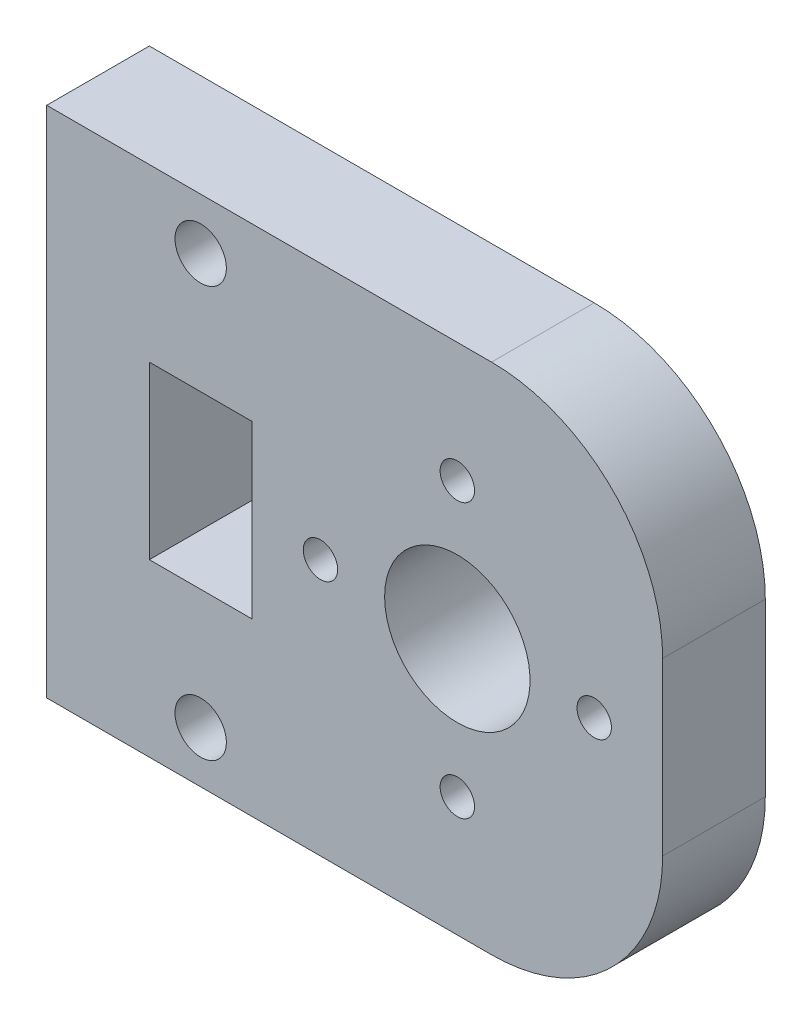
ISO-10303-21;
HEADER;
FILE_DESCRIPTION(('STEP AP214'),'2;1');
FILE_NAME('part.step','',(''),(''),'','','');
FILE_SCHEMA(('AUTOMOTIVE_DESIGN { 1 0 10303 214 1 1 1 1 }'));
ENDSEC;
DATA;
#1=APPLICATION_CONTEXT('core data for automotive mechanical design processes');
#2=APPLICATION_PROTOCOL_DEFINITION('international standard','automotive_design',2000,#1);
#3=PRODUCT_CONTEXT('',#1,'mechanical');
#4=PRODUCT('Part','Part','',(#3));
#5=PRODUCT_RELATED_PRODUCT_CATEGORY('part','',(#4));
#6=PRODUCT_DEFINITION_FORMATION('','',#4);
#7=PRODUCT_DEFINITION_CONTEXT('part definition',#1,'design');
#8=PRODUCT_DEFINITION('design','',#6,#7);
#9=PRODUCT_DEFINITION_SHAPE('','',#8);
#10=(LENGTH_UNIT() NAMED_UNIT(*) SI_UNIT(.MILLI.,.METRE.));
#11=(NAMED_UNIT(*) PLANE_ANGLE_UNIT() SI_UNIT($,.RADIAN.));
#12=(NAMED_UNIT(*) SI_UNIT($,.STERADIAN.) SOLID_ANGLE_UNIT());
#13=UNCERTAINTY_MEASURE_WITH_UNIT(LENGTH_MEASURE(1.E-05),#10,'distance_accuracy_value','');
#14=(GEOMETRIC_REPRESENTATION_CONTEXT(3) GLOBAL_UNCERTAINTY_ASSIGNED_CONTEXT((#13)) GLOBAL_UNIT_ASSIGNED_CONTEXT((#10,
#11,#12)) REPRESENTATION_CONTEXT('',''));
#15=CARTESIAN_POINT('',(0.,0.,0.));
#16=DIRECTION('',(0.,0.,1.));
#17=DIRECTION('',(1.,0.,0.));
#18=AXIS2_PLACEMENT_3D('',#15,#16,#17);
#19=CARTESIAN_POINT('',(-10.4153225806452,10.2157258064516,6.));
#20=DIRECTION('',(0.,0.,-1.));
#21=DIRECTION('',(-1.,0.,0.));
#22=AXIS2_PLACEMENT_3D('',#19,#20,#21);
#23=CYLINDRICAL_SURFACE('',#22,1.5);
#24=CARTESIAN_POINT('',(-10.4153225806452,10.2157258064516,6.));
#25=DIRECTION('',(0.,0.,-1.));
#26=DIRECTION('',(-1.,0.,0.));
#27=AXIS2_PLACEMENT_3D('',#24,#25,#26);
#28=CIRCLE('',#27,1.5);
#29=CARTESIAN_POINT('',(-11.9153225806452,10.2157258064516,6.));
#30=VERTEX_POINT('',#29);
#31=EDGE_CURVE('E177',#30,#30,#28,.T.);
#32=ORIENTED_EDGE('',*,*,#31,.F.);
#33=EDGE_LOOP('',(#32));
#34=FACE_BOUND('',#33,.T.);
#35=CARTESIAN_POINT('',(-10.4153225806452,10.2157258064516,3.));
#36=DIRECTION('',(0.,0.,-1.));
#37=DIRECTION('',(-1.,0.,0.));
#38=AXIS2_PLACEMENT_3D('',#35,#36,#37);
#39=CIRCLE('',#38,1.5);
#40=CARTESIAN_POINT('',(-11.9153225806452,10.2157258064516,3.));
#41=VERTEX_POINT('',#40);
#42=EDGE_CURVE('E164',#41,#41,#39,.F.);
#43=ORIENTED_EDGE('',*,*,#42,.F.);
#44=EDGE_LOOP('',(#43));
#45=FACE_BOUND('',#44,.T.);
#46=ADVANCED_FACE('F33',(#34,#45),#23,.F.);
#47=CARTESIAN_POINT('',(-10.4153225806452,-13.7842741935484,6.));
#48=DIRECTION('',(0.,0.,-1.));
#49=DIRECTION('',(-1.,0.,0.));
#50=AXIS2_PLACEMENT_3D('',#47,#48,#49);
#51=CYLINDRICAL_SURFACE('',#50,1.5);
#52=CARTESIAN_POINT('',(-10.4153225806452,-13.7842741935484,6.));
#53=DIRECTION('',(0.,0.,-1.));
#54=DIRECTION('',(-1.,0.,0.));
#55=AXIS2_PLACEMENT_3D('',#52,#53,#54);
#56=CIRCLE('',#55,1.5);
#57=CARTESIAN_POINT('',(-11.9153225806452,-13.7842741935484,6.));
#58=VERTEX_POINT('',#57);
#59=EDGE_CURVE('E174',#58,#58,#56,.T.);
#60=ORIENTED_EDGE('',*,*,#59,.F.);
#61=EDGE_LOOP('',(#60));
#62=FACE_BOUND('',#61,.T.);
#63=CARTESIAN_POINT('',(-10.4153225806452,-13.7842741935484,3.));
#64=DIRECTION('',(0.,0.,-1.));
#65=DIRECTION('',(-1.,0.,0.));
#66=AXIS2_PLACEMENT_3D('',#63,#64,#65);
#67=CIRCLE('',#66,1.5);
#68=CARTESIAN_POINT('',(-11.9153225806452,-13.7842741935484,3.));
#69=VERTEX_POINT('',#68);
#70=EDGE_CURVE('E170',#69,#69,#67,.F.);
#71=ORIENTED_EDGE('',*,*,#70,.F.);
#72=EDGE_LOOP('',(#71));
#73=FACE_BOUND('',#72,.T.);
#74=ADVANCED_FACE('F302',(#62,#73),#51,.F.);
#75=CARTESIAN_POINT('',(-24.4153225806452,-16.7842741935484,6.));
#76=DIRECTION('',(0.,1.,0.));
#77=DIRECTION('',(0.,0.,1.));
#78=AXIS2_PLACEMENT_3D('',#75,#76,#77);
#79=PLANE('',#78);
#80=DIRECTION('',(1.,0.,0.));
#81=VECTOR('',#80,1.);
#82=CARTESIAN_POINT('',(-24.4153225806452,-16.7842741935484,0.));
#83=LINE('',#82,#81);
#84=CARTESIAN_POINT('',(-19.4153225806452,-16.7842741935484,0.));
#85=VERTEX_POINT('',#84);
#86=CARTESIAN_POINT('',(6.58467741935482,-16.7842741935484,0.));
#87=VERTEX_POINT('',#86);
#88=EDGE_CURVE('E189',#85,#87,#83,.T.);
#89=ORIENTED_EDGE('',*,*,#88,.T.);
#90=DIRECTION('',(0.,0.,-1.));
#91=VECTOR('',#90,1.);
#92=CARTESIAN_POINT('',(6.58467741935482,-16.7842741935484,6.));
#93=LINE('',#92,#91);
#94=CARTESIAN_POINT('',(6.58467741935482,-16.7842741935484,6.));
#95=VERTEX_POINT('',#94);
#96=EDGE_CURVE('E56',#87,#95,#93,.F.);
#97=ORIENTED_EDGE('',*,*,#96,.T.);
#98=DIRECTION('',(1.,0.,0.));
#99=VECTOR('',#98,1.);
#100=CARTESIAN_POINT('',(-24.4153225806452,-16.7842741935484,6.));
#101=LINE('',#100,#99);
#102=CARTESIAN_POINT('',(-19.4153225806452,-16.7842741935484,6.));
#103=VERTEX_POINT('',#102);
#104=EDGE_CURVE('E192',#103,#95,#101,.T.);
#105=ORIENTED_EDGE('',*,*,#104,.F.);
#106=DIRECTION('',(0.,0.,1.));
#107=VECTOR('',#106,1.);
#108=CARTESIAN_POINT('',(-19.4153225806452,-16.7842741935484,0.));
#109=LINE('',#108,#107);
#110=EDGE_CURVE('E187',#85,#103,#109,.T.);
#111=ORIENTED_EDGE('',*,*,#110,.F.);
#112=EDGE_LOOP('',(#89,#97,#105,#111));
#113=FACE_BOUND('',#112,.T.);
#114=ADVANCED_FACE('F233',(#113),#79,.F.);
#115=CARTESIAN_POINT('',(-24.4153225806452,13.2157258064516,6.));
#116=DIRECTION('',(0.,-1.,0.));
#117=DIRECTION('',(0.,0.,-1.));
#118=AXIS2_PLACEMENT_3D('',#115,#116,#117);
#119=PLANE('',#118);
#120=DIRECTION('',(-1.,0.,0.));
#121=VECTOR('',#120,1.);
#122=CARTESIAN_POINT('',(-24.4153225806452,13.2157258064516,6.));
#123=LINE('',#122,#121);
#124=CARTESIAN_POINT('',(6.58467741935483,13.2157258064516,6.));
#125=VERTEX_POINT('',#124);
#126=CARTESIAN_POINT('',(-19.4153225806452,13.2157258064516,6.));
#127=VERTEX_POINT('',#126);
#128=EDGE_CURVE('E194',#125,#127,#123,.T.);
#129=ORIENTED_EDGE('',*,*,#128,.F.);
#130=DIRECTION('',(0.,0.,-1.));
#131=VECTOR('',#130,1.);
#132=CARTESIAN_POINT('',(6.58467741935483,13.2157258064516,6.));
#133=LINE('',#132,#131);
#134=CARTESIAN_POINT('',(6.58467741935483,13.2157258064516,0.));
#135=VERTEX_POINT('',#134);
#136=EDGE_CURVE('E11',#125,#135,#133,.T.);
#137=ORIENTED_EDGE('',*,*,#136,.T.);
#138=DIRECTION('',(-1.,0.,0.));
#139=VECTOR('',#138,1.);
#140=CARTESIAN_POINT('',(-24.4153225806452,13.2157258064516,0.));
#141=LINE('',#140,#139);
#142=CARTESIAN_POINT('',(-19.4153225806452,13.2157258064516,0.));
#143=VERTEX_POINT('',#142);
#144=EDGE_CURVE('E195',#135,#143,#141,.T.);
#145=ORIENTED_EDGE('',*,*,#144,.T.);
#146=DIRECTION('',(0.,0.,1.));
#147=VECTOR('',#146,1.);
#148=CARTESIAN_POINT('',(-19.4153225806452,13.2157258064516,0.));
#149=LINE('',#148,#147);
#150=EDGE_CURVE('E184',#143,#127,#149,.T.);
#151=ORIENTED_EDGE('',*,*,#150,.T.);
#152=EDGE_LOOP('',(#129,#137,#145,#151));
#153=FACE_BOUND('',#152,.T.);
#154=ADVANCED_FACE('F239',(#153),#119,.F.);
#155=CARTESIAN_POINT('',(0.,0.,6.));
#156=DIRECTION('',(0.,0.,1.));
#157=DIRECTION('',(1.,0.,0.));
#158=AXIS2_PLACEMENT_3D('',#155,#156,#157);
#159=PLANE('',#158);
#160=ORIENTED_EDGE('',*,*,#104,.T.);
#161=CARTESIAN_POINT('',(6.58467741935482,-6.78427419354839,6.));
#162=DIRECTION('',(0.,0.,1.));
#163=DIRECTION('',(1.,0.,0.));
#164=AXIS2_PLACEMENT_3D('',#161,#162,#163);
#165=CIRCLE('',#164,10.);
#166=CARTESIAN_POINT('',(16.5846774193548,-6.78427419354839,6.));
#167=VERTEX_POINT('',#166);
#168=EDGE_CURVE('E41',#95,#167,#165,.T.);
#169=ORIENTED_EDGE('',*,*,#168,.T.);
#170=DIRECTION('',(0.,1.,0.));
#171=VECTOR('',#170,1.);
#172=CARTESIAN_POINT('',(16.5846774193548,13.2157258064516,6.));
#173=LINE('',#172,#171);
#174=CARTESIAN_POINT('',(16.5846774193548,3.21572580645161,6.));
#175=VERTEX_POINT('',#174);
#176=EDGE_CURVE('E216',#167,#175,#173,.T.);
#177=ORIENTED_EDGE('',*,*,#176,.T.);
#178=CARTESIAN_POINT('',(6.58467741935483,3.21572580645161,6.));
#179=DIRECTION('',(0.,0.,1.));
#180=DIRECTION('',(1.,0.,0.));
#181=AXIS2_PLACEMENT_3D('',#178,#179,#180);
#182=CIRCLE('',#181,10.);
#183=EDGE_CURVE('E48',#175,#125,#182,.T.);
#184=ORIENTED_EDGE('',*,*,#183,.T.);
#185=ORIENTED_EDGE('',*,*,#128,.T.);
#186=DIRECTION('',(0.,1.,0.));
#187=VECTOR('',#186,1.);
#188=CARTESIAN_POINT('',(-19.4153225806452,13.2157258064516,6.));
#189=LINE('',#188,#187);
#190=EDGE_CURVE('E180',#103,#127,#189,.T.);
#191=ORIENTED_EDGE('',*,*,#190,.F.);
#192=EDGE_LOOP('',(#160,#169,#177,#184,#185,#191));
#193=FACE_BOUND('',#192,.T.);
#194=CARTESIAN_POINT('',(4.58467741935483,-1.78427419354838,6.));
#195=DIRECTION('',(0.,0.,-1.));
#196=DIRECTION('',(-1.,0.,0.));
#197=AXIS2_PLACEMENT_3D('',#194,#195,#196);
#198=CIRCLE('',#197,4.25);
#199=CARTESIAN_POINT('',(0.334677419354827,-1.78427419354838,6.));
#200=VERTEX_POINT('',#199);
#201=EDGE_CURVE('E244',#200,#200,#198,.T.);
#202=ORIENTED_EDGE('',*,*,#201,.T.);
#203=EDGE_LOOP('',(#202));
#204=FACE_BOUND('',#203,.T.);
#205=CARTESIAN_POINT('',(4.58467741935483,6.21572580645161,6.));
#206=DIRECTION('',(0.,0.,-1.));
#207=DIRECTION('',(-1.,0.,0.));
#208=AXIS2_PLACEMENT_3D('',#205,#206,#207);
#209=CIRCLE('',#208,1.005);
#210=CARTESIAN_POINT('',(3.57967741935483,6.21572580645161,6.));
#211=VERTEX_POINT('',#210);
#212=EDGE_CURVE('E247',#211,#211,#209,.T.);
#213=ORIENTED_EDGE('',*,*,#212,.T.);
#214=EDGE_LOOP('',(#213));
#215=FACE_BOUND('',#214,.T.);
#216=CARTESIAN_POINT('',(12.5846774193548,-1.78427419354838,6.));
#217=DIRECTION('',(0.,0.,-1.));
#218=DIRECTION('',(-1.,0.,0.));
#219=AXIS2_PLACEMENT_3D('',#216,#217,#218);
#220=CIRCLE('',#219,1.005);
#221=CARTESIAN_POINT('',(11.5796774193548,-1.78427419354838,6.));
#222=VERTEX_POINT('',#221);
#223=EDGE_CURVE('E253',#222,#222,#220,.T.);
#224=ORIENTED_EDGE('',*,*,#223,.T.);
#225=EDGE_LOOP('',(#224));
#226=FACE_BOUND('',#225,.T.);
#227=CARTESIAN_POINT('',(4.58467741935483,-9.78427419354838,6.));
#228=DIRECTION('',(0.,0.,-1.));
#229=DIRECTION('',(-1.,0.,0.));
#230=AXIS2_PLACEMENT_3D('',#227,#228,#229);
#231=CIRCLE('',#230,1.005);
#232=CARTESIAN_POINT('',(3.57967741935483,-9.78427419354838,6.));
#233=VERTEX_POINT('',#232);
#234=EDGE_CURVE('E259',#233,#233,#231,.T.);
#235=ORIENTED_EDGE('',*,*,#234,.T.);
#236=EDGE_LOOP('',(#235));
#237=FACE_BOUND('',#236,.T.);
#238=CARTESIAN_POINT('',(-3.41532258064517,-1.78427419354838,6.));
#239=DIRECTION('',(0.,0.,-1.));
#240=DIRECTION('',(-1.,0.,0.));
#241=AXIS2_PLACEMENT_3D('',#238,#239,#240);
#242=CIRCLE('',#241,1.005);
#243=CARTESIAN_POINT('',(-4.42032258064517,-1.78427419354838,6.));
#244=VERTEX_POINT('',#243);
#245=EDGE_CURVE('E151',#244,#244,#242,.T.);
#246=ORIENTED_EDGE('',*,*,#245,.T.);
#247=EDGE_LOOP('',(#246));
#248=FACE_BOUND('',#247,.T.);
#249=DIRECTION('',(0.,-1.,0.));
#250=VECTOR('',#249,1.);
#251=CARTESIAN_POINT('',(-7.41532258064517,3.21572580645161,6.));
#252=LINE('',#251,#250);
#253=CARTESIAN_POINT('',(-7.41532258064517,3.21572580645161,6.));
#254=VERTEX_POINT('',#253);
#255=CARTESIAN_POINT('',(-7.41532258064517,-6.78427419354839,6.));
#256=VERTEX_POINT('',#255);
#257=EDGE_CURVE('E117',#254,#256,#252,.T.);
#258=ORIENTED_EDGE('',*,*,#257,.T.);
#259=DIRECTION('',(-1.,0.,0.));
#260=VECTOR('',#259,1.);
#261=CARTESIAN_POINT('',(-7.41532258064517,-6.78427419354839,6.));
#262=LINE('',#261,#260);
#263=CARTESIAN_POINT('',(-13.4153225806452,-6.78427419354839,6.));
#264=VERTEX_POINT('',#263);
#265=EDGE_CURVE('E129',#256,#264,#262,.T.);
#266=ORIENTED_EDGE('',*,*,#265,.T.);
#267=DIRECTION('',(0.,1.,0.));
#268=VECTOR('',#267,1.);
#269=CARTESIAN_POINT('',(-13.4153225806452,3.21572580645161,6.));
#270=LINE('',#269,#268);
#271=CARTESIAN_POINT('',(-13.4153225806452,3.21572580645161,6.));
#272=VERTEX_POINT('',#271);
#273=EDGE_CURVE('E133',#264,#272,#270,.T.);
#274=ORIENTED_EDGE('',*,*,#273,.T.);
#275=DIRECTION('',(1.,0.,0.));
#276=VECTOR('',#275,1.);
#277=CARTESIAN_POINT('',(-7.41532258064517,3.21572580645161,6.));
#278=LINE('',#277,#276);
#279=EDGE_CURVE('E125',#272,#254,#278,.T.);
#280=ORIENTED_EDGE('',*,*,#279,.T.);
#281=EDGE_LOOP('',(#258,#266,#274,#280));
#282=FACE_BOUND('',#281,.T.);
#283=ORIENTED_EDGE('',*,*,#59,.T.);
#284=EDGE_LOOP('',(#283));
#285=FACE_BOUND('',#284,.T.);
#286=ORIENTED_EDGE('',*,*,#31,.T.);
#287=EDGE_LOOP('',(#286));
#288=FACE_BOUND('',#287,.T.);
#289=ADVANCED_FACE('F135',(#193,#204,#215,#226,#237,#248,#282,#285,#288),#159,.T.);
#290=CARTESIAN_POINT('',(0.,0.,0.));
#291=DIRECTION('',(0.,0.,1.));
#292=DIRECTION('',(1.,0.,0.));
#293=AXIS2_PLACEMENT_3D('',#290,#291,#292);
#294=PLANE('',#293);
#295=CARTESIAN_POINT('',(4.58467741935483,-1.78427419354838,0.));
#296=DIRECTION('',(0.,0.,-1.));
#297=DIRECTION('',(-1.,0.,0.));
#298=AXIS2_PLACEMENT_3D('',#295,#296,#297);
#299=CIRCLE('',#298,4.25);
#300=CARTESIAN_POINT('',(0.334677419354827,-1.78427419354838,0.));
#301=VERTEX_POINT('',#300);
#302=EDGE_CURVE('E225',#301,#301,#299,.T.);
#303=ORIENTED_EDGE('',*,*,#302,.F.);
#304=EDGE_LOOP('',(#303));
#305=FACE_BOUND('',#304,.T.);
#306=CARTESIAN_POINT('',(4.58467741935483,6.21572580645161,0.));
#307=DIRECTION('',(0.,0.,-1.));
#308=DIRECTION('',(-1.,0.,0.));
#309=AXIS2_PLACEMENT_3D('',#306,#307,#308);
#310=CIRCLE('',#309,1.005);
#311=CARTESIAN_POINT('',(3.57967741935483,6.21572580645161,0.));
#312=VERTEX_POINT('',#311);
#313=EDGE_CURVE('E250',#312,#312,#310,.T.);
#314=ORIENTED_EDGE('',*,*,#313,.F.);
#315=EDGE_LOOP('',(#314));
#316=FACE_BOUND('',#315,.T.);
#317=CARTESIAN_POINT('',(12.5846774193548,-1.78427419354838,0.));
#318=DIRECTION('',(0.,0.,-1.));
#319=DIRECTION('',(-1.,0.,0.));
#320=AXIS2_PLACEMENT_3D('',#317,#318,#319);
#321=CIRCLE('',#320,1.005);
#322=CARTESIAN_POINT('',(11.5796774193548,-1.78427419354838,0.));
#323=VERTEX_POINT('',#322);
#324=EDGE_CURVE('E256',#323,#323,#321,.T.);
#325=ORIENTED_EDGE('',*,*,#324,.F.);
#326=EDGE_LOOP('',(#325));
#327=FACE_BOUND('',#326,.T.);
#328=CARTESIAN_POINT('',(4.58467741935483,-9.78427419354838,0.));
#329=DIRECTION('',(0.,0.,-1.));
#330=DIRECTION('',(-1.,0.,0.));
#331=AXIS2_PLACEMENT_3D('',#328,#329,#330);
#332=CIRCLE('',#331,1.005);
#333=CARTESIAN_POINT('',(3.57967741935483,-9.78427419354838,0.));
#334=VERTEX_POINT('',#333);
#335=EDGE_CURVE('E262',#334,#334,#332,.T.);
#336=ORIENTED_EDGE('',*,*,#335,.F.);
#337=EDGE_LOOP('',(#336));
#338=FACE_BOUND('',#337,.T.);
#339=CARTESIAN_POINT('',(-3.41532258064517,-1.78427419354838,0.));
#340=DIRECTION('',(0.,0.,-1.));
#341=DIRECTION('',(-1.,0.,0.));
#342=AXIS2_PLACEMENT_3D('',#339,#340,#341);
#343=CIRCLE('',#342,1.005);
#344=CARTESIAN_POINT('',(-4.42032258064517,-1.78427419354838,0.));
#345=VERTEX_POINT('',#344);
#346=EDGE_CURVE('E144',#345,#345,#343,.T.);
#347=ORIENTED_EDGE('',*,*,#346,.F.);
#348=EDGE_LOOP('',(#347));
#349=FACE_BOUND('',#348,.T.);
#350=DIRECTION('',(-1.,0.,0.));
#351=VECTOR('',#350,1.);
#352=CARTESIAN_POINT('',(-7.41532258064517,-6.78427419354839,0.));
#353=LINE('',#352,#351);
#354=CARTESIAN_POINT('',(-7.41532258064517,-6.78427419354839,0.));
#355=VERTEX_POINT('',#354);
#356=CARTESIAN_POINT('',(-13.4153225806452,-6.78427419354839,0.));
#357=VERTEX_POINT('',#356);
#358=EDGE_CURVE('E150',#355,#357,#353,.T.);
#359=ORIENTED_EDGE('',*,*,#358,.F.);
#360=DIRECTION('',(0.,-1.,0.));
#361=VECTOR('',#360,1.);
#362=CARTESIAN_POINT('',(-7.41532258064517,3.21572580645161,0.));
#363=LINE('',#362,#361);
#364=CARTESIAN_POINT('',(-7.41532258064517,3.21572580645161,0.));
#365=VERTEX_POINT('',#364);
#366=EDGE_CURVE('E120',#365,#355,#363,.T.);
#367=ORIENTED_EDGE('',*,*,#366,.F.);
#368=DIRECTION('',(1.,0.,0.));
#369=VECTOR('',#368,1.);
#370=CARTESIAN_POINT('',(-7.41532258064517,3.21572580645161,0.));
#371=LINE('',#370,#369);
#372=CARTESIAN_POINT('',(-13.4153225806452,3.21572580645161,0.));
#373=VERTEX_POINT('',#372);
#374=EDGE_CURVE('E138',#373,#365,#371,.T.);
#375=ORIENTED_EDGE('',*,*,#374,.F.);
#376=DIRECTION('',(0.,1.,0.));
#377=VECTOR('',#376,1.);
#378=CARTESIAN_POINT('',(-13.4153225806452,3.21572580645161,0.));
#379=LINE('',#378,#377);
#380=EDGE_CURVE('E141',#357,#373,#379,.T.);
#381=ORIENTED_EDGE('',*,*,#380,.F.);
#382=EDGE_LOOP('',(#359,#367,#375,#381));
#383=FACE_BOUND('',#382,.T.);
#384=CARTESIAN_POINT('',(-10.4153225806452,10.2157258064516,0.));
#385=DIRECTION('',(0.,0.,-1.));
#386=DIRECTION('',(-1.,0.,0.));
#387=AXIS2_PLACEMENT_3D('',#384,#385,#386);
#388=CIRCLE('',#387,2.995);
#389=CARTESIAN_POINT('',(-13.4103225806452,10.2157258064516,0.));
#390=VERTEX_POINT('',#389);
#391=EDGE_CURVE('E157',#390,#390,#388,.T.);
#392=ORIENTED_EDGE('',*,*,#391,.F.);
#393=EDGE_LOOP('',(#392));
#394=FACE_BOUND('',#393,.T.);
#395=CARTESIAN_POINT('',(-10.4153225806452,-13.7842741935484,0.));
#396=DIRECTION('',(0.,0.,-1.));
#397=DIRECTION('',(-1.,0.,0.));
#398=AXIS2_PLACEMENT_3D('',#395,#396,#397);
#399=CIRCLE('',#398,2.995);
#400=CARTESIAN_POINT('',(-13.4103225806452,-13.7842741935484,0.));
#401=VERTEX_POINT('',#400);
#402=EDGE_CURVE('E171',#401,#401,#399,.T.);
#403=ORIENTED_EDGE('',*,*,#402,.F.);
#404=EDGE_LOOP('',(#403));
#405=FACE_BOUND('',#404,.T.);
#406=DIRECTION('',(0.,1.,0.));
#407=VECTOR('',#406,1.);
#408=CARTESIAN_POINT('',(16.5846774193548,13.2157258064516,0.));
#409=LINE('',#408,#407);
#410=CARTESIAN_POINT('',(16.5846774193548,-6.78427419354839,0.));
#411=VERTEX_POINT('',#410);
#412=CARTESIAN_POINT('',(16.5846774193548,3.21572580645161,0.));
#413=VERTEX_POINT('',#412);
#414=EDGE_CURVE('E226',#411,#413,#409,.T.);
#415=ORIENTED_EDGE('',*,*,#414,.F.);
#416=CARTESIAN_POINT('',(6.58467741935482,-6.78427419354839,0.));
#417=DIRECTION('',(0.,0.,1.));
#418=DIRECTION('',(1.,0.,0.));
#419=AXIS2_PLACEMENT_3D('',#416,#417,#418);
#420=CIRCLE('',#419,10.);
#421=EDGE_CURVE('E210',#411,#87,#420,.F.);
#422=ORIENTED_EDGE('',*,*,#421,.T.);
#423=ORIENTED_EDGE('',*,*,#88,.F.);
#424=DIRECTION('',(0.,1.,0.));
#425=VECTOR('',#424,1.);
#426=CARTESIAN_POINT('',(-19.4153225806452,13.2157258064516,0.));
#427=LINE('',#426,#425);
#428=EDGE_CURVE('E181',#85,#143,#427,.T.);
#429=ORIENTED_EDGE('',*,*,#428,.T.);
#430=ORIENTED_EDGE('',*,*,#144,.F.);
#431=CARTESIAN_POINT('',(6.58467741935483,3.21572580645161,0.));
#432=DIRECTION('',(0.,0.,1.));
#433=DIRECTION('',(1.,0.,0.));
#434=AXIS2_PLACEMENT_3D('',#431,#432,#433);
#435=CIRCLE('',#434,10.);
#436=EDGE_CURVE('E208',#135,#413,#435,.F.);
#437=ORIENTED_EDGE('',*,*,#436,.T.);
#438=EDGE_LOOP('',(#415,#422,#423,#429,#430,#437));
#439=FACE_BOUND('',#438,.T.);
#440=ADVANCED_FACE('F231',(#305,#316,#327,#338,#349,#383,#394,#405,#439),#294,.F.);
#441=CARTESIAN_POINT('',(-19.4153225806452,13.2157258064516,0.));
#442=DIRECTION('',(1.,0.,0.));
#443=DIRECTION('',(0.,1.,0.));
#444=AXIS2_PLACEMENT_3D('',#441,#442,#443);
#445=PLANE('',#444);
#446=ORIENTED_EDGE('',*,*,#190,.T.);
#447=ORIENTED_EDGE('',*,*,#150,.F.);
#448=ORIENTED_EDGE('',*,*,#428,.F.);
#449=ORIENTED_EDGE('',*,*,#110,.T.);
#450=EDGE_LOOP('',(#446,#447,#448,#449));
#451=FACE_BOUND('',#450,.T.);
#452=ADVANCED_FACE('F235',(#451),#445,.F.);
#453=CARTESIAN_POINT('',(-10.4153225806452,-13.7842741935484,3.));
#454=DIRECTION('',(0.,0.,-1.));
#455=DIRECTION('',(-1.,0.,0.));
#456=AXIS2_PLACEMENT_3D('',#453,#454,#455);
#457=PLANE('',#456);
#458=CARTESIAN_POINT('',(-10.4153225806452,-13.7842741935484,3.));
#459=DIRECTION('',(0.,0.,-1.));
#460=DIRECTION('',(-1.,0.,0.));
#461=AXIS2_PLACEMENT_3D('',#458,#459,#460);
#462=CIRCLE('',#461,2.995);
#463=CARTESIAN_POINT('',(-13.4103225806452,-13.7842741935484,3.));
#464=VERTEX_POINT('',#463);
#465=EDGE_CURVE('E167',#464,#464,#462,.T.);
#466=ORIENTED_EDGE('',*,*,#465,.T.);
#467=EDGE_LOOP('',(#466));
#468=FACE_BOUND('',#467,.T.);
#469=ORIENTED_EDGE('',*,*,#70,.T.);
#470=EDGE_LOOP('',(#469));
#471=FACE_BOUND('',#470,.T.);
#472=ADVANCED_FACE('F287',(#468,#471),#457,.T.);
#473=CARTESIAN_POINT('',(-10.4153225806452,-13.7842741935484,3.));
#474=DIRECTION('',(0.,0.,-1.));
#475=DIRECTION('',(-1.,0.,0.));
#476=AXIS2_PLACEMENT_3D('',#473,#474,#475);
#477=CYLINDRICAL_SURFACE('',#476,2.995);
#478=ORIENTED_EDGE('',*,*,#465,.F.);
#479=EDGE_LOOP('',(#478));
#480=FACE_BOUND('',#479,.T.);
#481=ORIENTED_EDGE('',*,*,#402,.T.);
#482=EDGE_LOOP('',(#481));
#483=FACE_BOUND('',#482,.T.);
#484=ADVANCED_FACE('F284',(#480,#483),#477,.F.);
#485=CARTESIAN_POINT('',(-10.4153225806452,10.2157258064516,3.));
#486=DIRECTION('',(0.,0.,-1.));
#487=DIRECTION('',(-1.,0.,0.));
#488=AXIS2_PLACEMENT_3D('',#485,#486,#487);
#489=PLANE('',#488);
#490=CARTESIAN_POINT('',(-10.4153225806452,10.2157258064516,3.));
#491=DIRECTION('',(0.,0.,-1.));
#492=DIRECTION('',(-1.,0.,0.));
#493=AXIS2_PLACEMENT_3D('',#490,#491,#492);
#494=CIRCLE('',#493,2.995);
#495=CARTESIAN_POINT('',(-13.4103225806452,10.2157258064516,3.));
#496=VERTEX_POINT('',#495);
#497=EDGE_CURVE('E161',#496,#496,#494,.T.);
#498=ORIENTED_EDGE('',*,*,#497,.T.);
#499=EDGE_LOOP('',(#498));
#500=FACE_BOUND('',#499,.T.);
#501=ORIENTED_EDGE('',*,*,#42,.T.);
#502=EDGE_LOOP('',(#501));
#503=FACE_BOUND('',#502,.T.);
#504=ADVANCED_FACE('F286',(#500,#503),#489,.T.);
#505=CARTESIAN_POINT('',(-10.4153225806452,10.2157258064516,3.));
#506=DIRECTION('',(0.,0.,-1.));
#507=DIRECTION('',(-1.,0.,0.));
#508=AXIS2_PLACEMENT_3D('',#505,#506,#507);
#509=CYLINDRICAL_SURFACE('',#508,2.995);
#510=ORIENTED_EDGE('',*,*,#497,.F.);
#511=EDGE_LOOP('',(#510));
#512=FACE_BOUND('',#511,.T.);
#513=ORIENTED_EDGE('',*,*,#391,.T.);
#514=EDGE_LOOP('',(#513));
#515=FACE_BOUND('',#514,.T.);
#516=ADVANCED_FACE('F294',(#512,#515),#509,.F.);
#517=CARTESIAN_POINT('',(-7.41532258064517,3.21572580645161,6.));
#518=DIRECTION('',(1.,0.,0.));
#519=DIRECTION('',(0.,0.,-1.));
#520=AXIS2_PLACEMENT_3D('',#517,#518,#519);
#521=PLANE('',#520);
#522=ORIENTED_EDGE('',*,*,#366,.T.);
#523=DIRECTION('',(0.,0.,-1.));
#524=VECTOR('',#523,1.);
#525=CARTESIAN_POINT('',(-7.41532258064517,-6.78427419354839,6.));
#526=LINE('',#525,#524);
#527=EDGE_CURVE('E113',#256,#355,#526,.T.);
#528=ORIENTED_EDGE('',*,*,#527,.F.);
#529=ORIENTED_EDGE('',*,*,#257,.F.);
#530=DIRECTION('',(0.,0.,-1.));
#531=VECTOR('',#530,1.);
#532=CARTESIAN_POINT('',(-7.41532258064517,3.21572580645161,6.));
#533=LINE('',#532,#531);
#534=EDGE_CURVE('E155',#254,#365,#533,.T.);
#535=ORIENTED_EDGE('',*,*,#534,.T.);
#536=EDGE_LOOP('',(#522,#528,#529,#535));
#537=FACE_BOUND('',#536,.T.);
#538=ADVANCED_FACE('F115',(#537),#521,.F.);
#539=CARTESIAN_POINT('',(-7.41532258064517,3.21572580645161,6.));
#540=DIRECTION('',(0.,1.,0.));
#541=DIRECTION('',(0.,0.,1.));
#542=AXIS2_PLACEMENT_3D('',#539,#540,#541);
#543=PLANE('',#542);
#544=ORIENTED_EDGE('',*,*,#374,.T.);
#545=ORIENTED_EDGE('',*,*,#534,.F.);
#546=ORIENTED_EDGE('',*,*,#279,.F.);
#547=DIRECTION('',(0.,0.,-1.));
#548=VECTOR('',#547,1.);
#549=CARTESIAN_POINT('',(-13.4153225806452,3.21572580645161,6.));
#550=LINE('',#549,#548);
#551=EDGE_CURVE('E158',#272,#373,#550,.T.);
#552=ORIENTED_EDGE('',*,*,#551,.T.);
#553=EDGE_LOOP('',(#544,#545,#546,#552));
#554=FACE_BOUND('',#553,.T.);
#555=ADVANCED_FACE('F347',(#554),#543,.F.);
#556=CARTESIAN_POINT('',(-13.4153225806452,3.21572580645161,6.));
#557=DIRECTION('',(-1.,0.,0.));
#558=DIRECTION('',(0.,-1.,0.));
#559=AXIS2_PLACEMENT_3D('',#556,#557,#558);
#560=PLANE('',#559);
#561=ORIENTED_EDGE('',*,*,#380,.T.);
#562=ORIENTED_EDGE('',*,*,#551,.F.);
#563=ORIENTED_EDGE('',*,*,#273,.F.);
#564=DIRECTION('',(0.,0.,-1.));
#565=VECTOR('',#564,1.);
#566=CARTESIAN_POINT('',(-13.4153225806452,-6.78427419354839,6.));
#567=LINE('',#566,#565);
#568=EDGE_CURVE('E124',#264,#357,#567,.T.);
#569=ORIENTED_EDGE('',*,*,#568,.T.);
#570=EDGE_LOOP('',(#561,#562,#563,#569));
#571=FACE_BOUND('',#570,.T.);
#572=ADVANCED_FACE('F350',(#571),#560,.F.);
#573=CARTESIAN_POINT('',(-7.41532258064517,-6.78427419354839,6.));
#574=DIRECTION('',(0.,-1.,0.));
#575=DIRECTION('',(0.,0.,-1.));
#576=AXIS2_PLACEMENT_3D('',#573,#574,#575);
#577=PLANE('',#576);
#578=ORIENTED_EDGE('',*,*,#358,.T.);
#579=ORIENTED_EDGE('',*,*,#568,.F.);
#580=ORIENTED_EDGE('',*,*,#265,.F.);
#581=ORIENTED_EDGE('',*,*,#527,.T.);
#582=EDGE_LOOP('',(#578,#579,#580,#581));
#583=FACE_BOUND('',#582,.T.);
#584=ADVANCED_FACE('F130',(#583),#577,.F.);
#585=CARTESIAN_POINT('',(-3.41532258064517,-1.78427419354838,6.));
#586=DIRECTION('',(0.,0.,-1.));
#587=DIRECTION('',(-1.,0.,0.));
#588=AXIS2_PLACEMENT_3D('',#585,#586,#587);
#589=CYLINDRICAL_SURFACE('',#588,1.005);
#590=ORIENTED_EDGE('',*,*,#245,.F.);
#591=EDGE_LOOP('',(#590));
#592=FACE_BOUND('',#591,.T.);
#593=ORIENTED_EDGE('',*,*,#346,.T.);
#594=EDGE_LOOP('',(#593));
#595=FACE_BOUND('',#594,.T.);
#596=ADVANCED_FACE('F272',(#592,#595),#589,.F.);
#597=CARTESIAN_POINT('',(4.58467741935483,-9.78427419354838,6.));
#598=DIRECTION('',(0.,0.,-1.));
#599=DIRECTION('',(-1.,0.,0.));
#600=AXIS2_PLACEMENT_3D('',#597,#598,#599);
#601=CYLINDRICAL_SURFACE('',#600,1.005);
#602=ORIENTED_EDGE('',*,*,#234,.F.);
#603=EDGE_LOOP('',(#602));
#604=FACE_BOUND('',#603,.T.);
#605=ORIENTED_EDGE('',*,*,#335,.T.);
#606=EDGE_LOOP('',(#605));
#607=FACE_BOUND('',#606,.T.);
#608=ADVANCED_FACE('F339',(#604,#607),#601,.F.);
#609=CARTESIAN_POINT('',(12.5846774193548,-1.78427419354838,6.));
#610=DIRECTION('',(0.,0.,-1.));
#611=DIRECTION('',(-1.,0.,0.));
#612=AXIS2_PLACEMENT_3D('',#609,#610,#611);
#613=CYLINDRICAL_SURFACE('',#612,1.005);
#614=ORIENTED_EDGE('',*,*,#223,.F.);
#615=EDGE_LOOP('',(#614));
#616=FACE_BOUND('',#615,.T.);
#617=ORIENTED_EDGE('',*,*,#324,.T.);
#618=EDGE_LOOP('',(#617));
#619=FACE_BOUND('',#618,.T.);
#620=ADVANCED_FACE('F335',(#616,#619),#613,.F.);
#621=CARTESIAN_POINT('',(4.58467741935483,6.21572580645161,6.));
#622=DIRECTION('',(0.,0.,-1.));
#623=DIRECTION('',(-1.,0.,0.));
#624=AXIS2_PLACEMENT_3D('',#621,#622,#623);
#625=CYLINDRICAL_SURFACE('',#624,1.005);
#626=ORIENTED_EDGE('',*,*,#212,.F.);
#627=EDGE_LOOP('',(#626));
#628=FACE_BOUND('',#627,.T.);
#629=ORIENTED_EDGE('',*,*,#313,.T.);
#630=EDGE_LOOP('',(#629));
#631=FACE_BOUND('',#630,.T.);
#632=ADVANCED_FACE('F329',(#628,#631),#625,.F.);
#633=CARTESIAN_POINT('',(4.58467741935483,-1.78427419354838,6.));
#634=DIRECTION('',(0.,0.,-1.));
#635=DIRECTION('',(-1.,0.,0.));
#636=AXIS2_PLACEMENT_3D('',#633,#634,#635);
#637=CYLINDRICAL_SURFACE('',#636,4.25);
#638=ORIENTED_EDGE('',*,*,#201,.F.);
#639=EDGE_LOOP('',(#638));
#640=FACE_BOUND('',#639,.T.);
#641=ORIENTED_EDGE('',*,*,#302,.T.);
#642=EDGE_LOOP('',(#641));
#643=FACE_BOUND('',#642,.T.);
#644=ADVANCED_FACE('F324',(#640,#643),#637,.F.);
#645=CARTESIAN_POINT('',(16.5846774193548,13.2157258064516,6.));
#646=DIRECTION('',(-1.,0.,0.));
#647=DIRECTION('',(0.,-1.,0.));
#648=AXIS2_PLACEMENT_3D('',#645,#646,#647);
#649=PLANE('',#648);
#650=ORIENTED_EDGE('',*,*,#176,.F.);
#651=DIRECTION('',(0.,0.,-1.));
#652=VECTOR('',#651,1.);
#653=CARTESIAN_POINT('',(16.5846774193548,-6.78427419354839,6.));
#654=LINE('',#653,#652);
#655=EDGE_CURVE('E205',#167,#411,#654,.T.);
#656=ORIENTED_EDGE('',*,*,#655,.T.);
#657=ORIENTED_EDGE('',*,*,#414,.T.);
#658=DIRECTION('',(0.,0.,-1.));
#659=VECTOR('',#658,1.);
#660=CARTESIAN_POINT('',(16.5846774193548,3.21572580645161,6.));
#661=LINE('',#660,#659);
#662=EDGE_CURVE('E197',#413,#175,#661,.F.);
#663=ORIENTED_EDGE('',*,*,#662,.T.);
#664=EDGE_LOOP('',(#650,#656,#657,#663));
#665=FACE_BOUND('',#664,.T.);
#666=ADVANCED_FACE('F221',(#665),#649,.F.);
#667=CARTESIAN_POINT('',(6.58467741935482,-6.78427419354839,6.));
#668=DIRECTION('',(0.,0.,-1.));
#669=DIRECTION('',(-1.,0.,0.));
#670=AXIS2_PLACEMENT_3D('',#667,#668,#669);
#671=CYLINDRICAL_SURFACE('',#670,10.);
#672=ORIENTED_EDGE('',*,*,#168,.F.);
#673=ORIENTED_EDGE('',*,*,#96,.F.);
#674=ORIENTED_EDGE('',*,*,#421,.F.);
#675=ORIENTED_EDGE('',*,*,#655,.F.);
#676=EDGE_LOOP('',(#672,#673,#674,#675));
#677=FACE_BOUND('',#676,.T.);
#678=ADVANCED_FACE('F228',(#677),#671,.T.);
#679=CARTESIAN_POINT('',(6.58467741935483,3.21572580645161,6.));
#680=DIRECTION('',(0.,0.,-1.));
#681=DIRECTION('',(-1.,0.,0.));
#682=AXIS2_PLACEMENT_3D('',#679,#680,#681);
#683=CYLINDRICAL_SURFACE('',#682,10.);
#684=ORIENTED_EDGE('',*,*,#183,.F.);
#685=ORIENTED_EDGE('',*,*,#662,.F.);
#686=ORIENTED_EDGE('',*,*,#436,.F.);
#687=ORIENTED_EDGE('',*,*,#136,.F.);
#688=EDGE_LOOP('',(#684,#685,#686,#687));
#689=FACE_BOUND('',#688,.T.);
#690=ADVANCED_FACE('F35',(#689),#683,.T.);
#691=CLOSED_SHELL('',(#46,#74,#114,#154,#289,#440,#452,#472,#484,#504,#516,#538,#555,#572,#584,
#596,#608,#620,#632,#644,#666,#678,#690));
#692=MANIFOLD_SOLID_BREP('B2',#691);
#693=ADVANCED_BREP_SHAPE_REPRESENTATION('',(#18,#692),#14);
#694=SHAPE_DEFINITION_REPRESENTATION(#9,#693);
ENDSEC;
END-ISO-10303-21;
